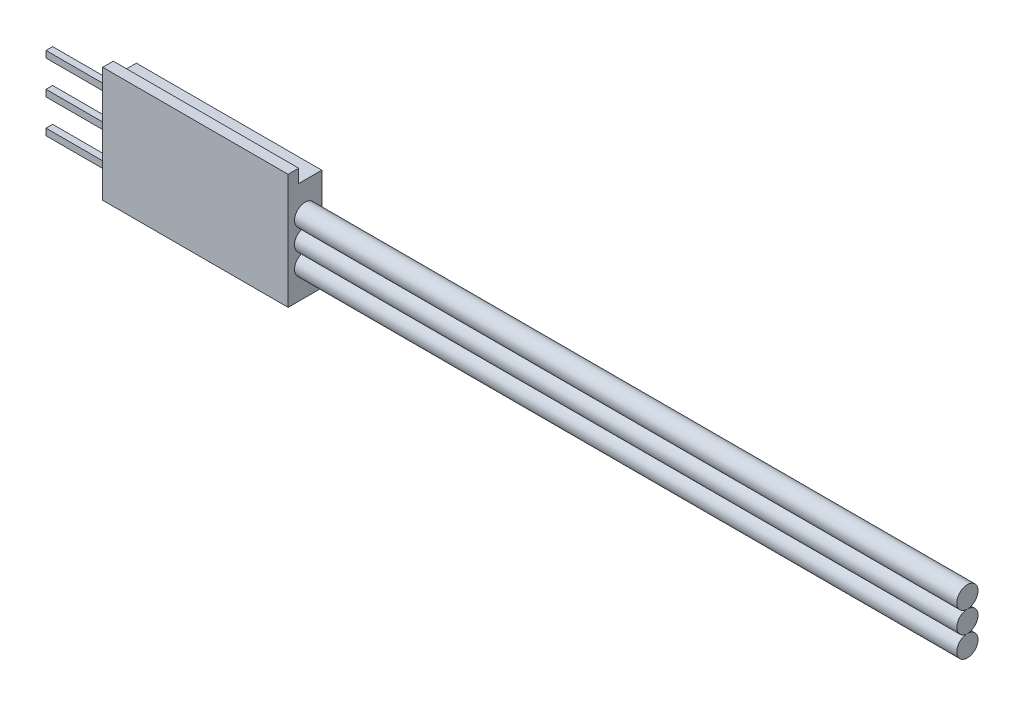
ISO-10303-21;
HEADER;
FILE_DESCRIPTION(('STEP AP214'),'2;1');
FILE_NAME('part.step','',(''),(''),'','','');
FILE_SCHEMA(('AUTOMOTIVE_DESIGN { 1 0 10303 214 1 1 1 1 }'));
ENDSEC;
DATA;
#1=APPLICATION_CONTEXT('core data for automotive mechanical design processes');
#2=APPLICATION_PROTOCOL_DEFINITION('international standard','automotive_design',2000,#1);
#3=PRODUCT_CONTEXT('',#1,'mechanical');
#4=PRODUCT('Part','Part','',(#3));
#5=PRODUCT_RELATED_PRODUCT_CATEGORY('part','',(#4));
#6=PRODUCT_DEFINITION_FORMATION('','',#4);
#7=PRODUCT_DEFINITION_CONTEXT('part definition',#1,'design');
#8=PRODUCT_DEFINITION('design','',#6,#7);
#9=PRODUCT_DEFINITION_SHAPE('','',#8);
#10=(LENGTH_UNIT() NAMED_UNIT(*) SI_UNIT(.MILLI.,.METRE.));
#11=(NAMED_UNIT(*) PLANE_ANGLE_UNIT() SI_UNIT($,.RADIAN.));
#12=(NAMED_UNIT(*) SI_UNIT($,.STERADIAN.) SOLID_ANGLE_UNIT());
#13=UNCERTAINTY_MEASURE_WITH_UNIT(LENGTH_MEASURE(1.E-05),#10,'distance_accuracy_value','');
#14=(GEOMETRIC_REPRESENTATION_CONTEXT(3) GLOBAL_UNCERTAINTY_ASSIGNED_CONTEXT((#13)) GLOBAL_UNIT_ASSIGNED_CONTEXT((#10,
#11,#12)) REPRESENTATION_CONTEXT('',''));
#15=CARTESIAN_POINT('',(0.,0.,0.));
#16=DIRECTION('',(0.,0.,1.));
#17=DIRECTION('',(1.,0.,0.));
#18=AXIS2_PLACEMENT_3D('',#15,#16,#17);
#19=CARTESIAN_POINT('',(7.01,0.,0.));
#20=DIRECTION('',(1.,0.,0.));
#21=DIRECTION('',(0.,0.,-1.));
#22=AXIS2_PLACEMENT_3D('',#19,#20,#21);
#23=PLANE('',#22);
#24=CARTESIAN_POINT('',(7.01,0.,0.));
#25=DIRECTION('',(1.,0.,0.));
#26=DIRECTION('',(0.,1.,0.));
#27=AXIS2_PLACEMENT_3D('',#24,#25,#26);
#28=CIRCLE('',#27,0.800000000000006);
#29=CARTESIAN_POINT('',(7.01,0.800000000000004,0.));
#30=VERTEX_POINT('',#29);
#31=EDGE_CURVE('P0_E17',#30,#30,#28,.T.);
#32=ORIENTED_EDGE('',*,*,#31,.F.);
#33=EDGE_LOOP('',(#32));
#34=FACE_BOUND('',#33,.T.);
#35=ADVANCED_FACE('P0_F14',(#34),#23,.F.);
#36=CARTESIAN_POINT('',(57.01,0.,0.));
#37=DIRECTION('',(1.,0.,0.));
#38=DIRECTION('',(0.,0.,-1.));
#39=AXIS2_PLACEMENT_3D('',#36,#37,#38);
#40=PLANE('',#39);
#41=CARTESIAN_POINT('',(57.01,0.,0.));
#42=DIRECTION('',(1.,0.,0.));
#43=DIRECTION('',(0.,1.,0.));
#44=AXIS2_PLACEMENT_3D('',#41,#42,#43);
#45=CIRCLE('',#44,0.800000000000006);
#46=CARTESIAN_POINT('',(57.01,0.799999999999919,0.));
#47=VERTEX_POINT('',#46);
#48=EDGE_CURVE('P0_E10',#47,#47,#45,.F.);
#49=ORIENTED_EDGE('',*,*,#48,.F.);
#50=EDGE_LOOP('',(#49));
#51=FACE_BOUND('',#50,.T.);
#52=ADVANCED_FACE('P0_F29',(#51),#40,.T.);
#53=CARTESIAN_POINT('',(6.01,0.,0.));
#54=DIRECTION('',(1.,0.,0.));
#55=DIRECTION('',(0.,1.,0.));
#56=AXIS2_PLACEMENT_3D('',#53,#54,#55);
#57=CYLINDRICAL_SURFACE('',#56,0.800000000000006);
#58=ORIENTED_EDGE('',*,*,#31,.T.);
#59=EDGE_LOOP('',(#58));
#60=FACE_BOUND('',#59,.T.);
#61=ORIENTED_EDGE('',*,*,#48,.T.);
#62=EDGE_LOOP('',(#61));
#63=FACE_BOUND('',#62,.T.);
#64=ADVANCED_FACE('P0_F26',(#60,#63),#57,.T.);
#65=CLOSED_SHELL('',(#35,#52,#64));
#66=MANIFOLD_SOLID_BREP('P0_B1',#65);
#67=CARTESIAN_POINT('',(-7.,-2.79,-0.25));
#68=DIRECTION('',(0.,-1.,0.));
#69=DIRECTION('',(0.,0.,-1.));
#70=AXIS2_PLACEMENT_3D('',#67,#68,#69);
#71=PLANE('',#70);
#72=DIRECTION('',(1.,0.,0.));
#73=VECTOR('',#72,1.);
#74=CARTESIAN_POINT('',(-7.,-2.79,0.25));
#75=LINE('',#74,#73);
#76=CARTESIAN_POINT('',(-12.3,-2.79,0.25));
#77=VERTEX_POINT('',#76);
#78=CARTESIAN_POINT('',(-7.,-2.79,0.25));
#79=VERTEX_POINT('',#78);
#80=EDGE_CURVE('P1_E142',#77,#79,#75,.T.);
#81=ORIENTED_EDGE('',*,*,#80,.F.);
#82=DIRECTION('',(0.,0.,-1.));
#83=VECTOR('',#82,1.);
#84=CARTESIAN_POINT('',(-12.3,-2.79,-0.25));
#85=LINE('',#84,#83);
#86=CARTESIAN_POINT('',(-12.3,-2.79,-0.25));
#87=VERTEX_POINT('',#86);
#88=EDGE_CURVE('P1_E147',#77,#87,#85,.T.);
#89=ORIENTED_EDGE('',*,*,#88,.T.);
#90=DIRECTION('',(-1.,0.,0.));
#91=VECTOR('',#90,1.);
#92=CARTESIAN_POINT('',(-7.,-2.79,-0.25));
#93=LINE('',#92,#91);
#94=CARTESIAN_POINT('',(-7.,-2.79,-0.25));
#95=VERTEX_POINT('',#94);
#96=EDGE_CURVE('P1_E145',#95,#87,#93,.T.);
#97=ORIENTED_EDGE('',*,*,#96,.F.);
#98=DIRECTION('',(0.,0.,-1.));
#99=VECTOR('',#98,1.);
#100=CARTESIAN_POINT('',(-7.,-2.79,-0.25));
#101=LINE('',#100,#99);
#102=EDGE_CURVE('P1_E19',#95,#79,#101,.F.);
#103=ORIENTED_EDGE('',*,*,#102,.T.);
#104=EDGE_LOOP('',(#81,#89,#97,#103));
#105=FACE_BOUND('',#104,.T.);
#106=ADVANCED_FACE('P1_F16',(#105),#71,.T.);
#107=CARTESIAN_POINT('',(-7.,0.25,-0.25));
#108=DIRECTION('',(0.,0.,-1.));
#109=DIRECTION('',(-1.,0.,0.));
#110=AXIS2_PLACEMENT_3D('',#107,#108,#109);
#111=PLANE('',#110);
#112=DIRECTION('',(1.,0.,0.));
#113=VECTOR('',#112,1.);
#114=CARTESIAN_POINT('',(-7.,-0.25,-0.25));
#115=LINE('',#114,#113);
#116=CARTESIAN_POINT('',(-12.3,-0.25,-0.25));
#117=VERTEX_POINT('',#116);
#118=CARTESIAN_POINT('',(-7.,-0.25,-0.25));
#119=VERTEX_POINT('',#118);
#120=EDGE_CURVE('P1_E183',#117,#119,#115,.T.);
#121=ORIENTED_EDGE('',*,*,#120,.F.);
#122=DIRECTION('',(0.,1.,0.));
#123=VECTOR('',#122,1.);
#124=CARTESIAN_POINT('',(-12.3,0.25,-0.25));
#125=LINE('',#124,#123);
#126=CARTESIAN_POINT('',(-12.3,0.25,-0.25));
#127=VERTEX_POINT('',#126);
#128=EDGE_CURVE('P1_E167',#117,#127,#125,.T.);
#129=ORIENTED_EDGE('',*,*,#128,.T.);
#130=DIRECTION('',(1.,0.,0.));
#131=VECTOR('',#130,1.);
#132=CARTESIAN_POINT('',(-7.,0.25,-0.25));
#133=LINE('',#132,#131);
#134=CARTESIAN_POINT('',(-7.,0.25,-0.25));
#135=VERTEX_POINT('',#134);
#136=EDGE_CURVE('P1_E193',#135,#127,#133,.F.);
#137=ORIENTED_EDGE('',*,*,#136,.F.);
#138=DIRECTION('',(0.,1.,0.));
#139=VECTOR('',#138,1.);
#140=CARTESIAN_POINT('',(-7.,0.25,-0.25));
#141=LINE('',#140,#139);
#142=EDGE_CURVE('P1_E169',#135,#119,#141,.F.);
#143=ORIENTED_EDGE('',*,*,#142,.T.);
#144=EDGE_LOOP('',(#121,#129,#137,#143));
#145=FACE_BOUND('',#144,.T.);
#146=ADVANCED_FACE('P1_F494',(#145),#111,.T.);
#147=CARTESIAN_POINT('',(-7.,2.79,-0.25));
#148=DIRECTION('',(0.,0.,-1.));
#149=DIRECTION('',(-1.,0.,0.));
#150=AXIS2_PLACEMENT_3D('',#147,#148,#149);
#151=PLANE('',#150);
#152=DIRECTION('',(1.,0.,0.));
#153=VECTOR('',#152,1.);
#154=CARTESIAN_POINT('',(-7.,2.29,-0.25));
#155=LINE('',#154,#153);
#156=CARTESIAN_POINT('',(-12.3,2.29,-0.25));
#157=VERTEX_POINT('',#156);
#158=CARTESIAN_POINT('',(-7.,2.29,-0.25));
#159=VERTEX_POINT('',#158);
#160=EDGE_CURVE('P1_E202',#157,#159,#155,.T.);
#161=ORIENTED_EDGE('',*,*,#160,.F.);
#162=DIRECTION('',(0.,1.,0.));
#163=VECTOR('',#162,1.);
#164=CARTESIAN_POINT('',(-12.3,2.79,-0.25));
#165=LINE('',#164,#163);
#166=CARTESIAN_POINT('',(-12.3,2.79,-0.25));
#167=VERTEX_POINT('',#166);
#168=EDGE_CURVE('P1_E160',#157,#167,#165,.T.);
#169=ORIENTED_EDGE('',*,*,#168,.T.);
#170=DIRECTION('',(1.,0.,0.));
#171=VECTOR('',#170,1.);
#172=CARTESIAN_POINT('',(-7.,2.79,-0.25));
#173=LINE('',#172,#171);
#174=CARTESIAN_POINT('',(-7.,2.79,-0.25));
#175=VERTEX_POINT('',#174);
#176=EDGE_CURVE('P1_E210',#175,#167,#173,.F.);
#177=ORIENTED_EDGE('',*,*,#176,.F.);
#178=DIRECTION('',(0.,1.,0.));
#179=VECTOR('',#178,1.);
#180=CARTESIAN_POINT('',(-7.,2.79,-0.25));
#181=LINE('',#180,#179);
#182=EDGE_CURVE('P1_E162',#175,#159,#181,.F.);
#183=ORIENTED_EDGE('',*,*,#182,.T.);
#184=EDGE_LOOP('',(#161,#169,#177,#183));
#185=FACE_BOUND('',#184,.T.);
#186=ADVANCED_FACE('P1_F486',(#185),#151,.T.);
#187=CARTESIAN_POINT('',(-7.,-2.79,0.25));
#188=DIRECTION('',(0.,0.,1.));
#189=DIRECTION('',(1.,0.,0.));
#190=AXIS2_PLACEMENT_3D('',#187,#188,#189);
#191=PLANE('',#190);
#192=DIRECTION('',(1.,0.,0.));
#193=VECTOR('',#192,1.);
#194=CARTESIAN_POINT('',(-7.,-2.29,0.25));
#195=LINE('',#194,#193);
#196=CARTESIAN_POINT('',(-12.3,-2.29,0.25));
#197=VERTEX_POINT('',#196);
#198=CARTESIAN_POINT('',(-7.,-2.29,0.25));
#199=VERTEX_POINT('',#198);
#200=EDGE_CURVE('P1_E223',#197,#199,#195,.T.);
#201=ORIENTED_EDGE('',*,*,#200,.F.);
#202=DIRECTION('',(0.,1.,0.));
#203=VECTOR('',#202,1.);
#204=CARTESIAN_POINT('',(-12.3,0.,0.25));
#205=LINE('',#204,#203);
#206=EDGE_CURVE('P1_E159',#77,#197,#205,.T.);
#207=ORIENTED_EDGE('',*,*,#206,.F.);
#208=ORIENTED_EDGE('',*,*,#80,.T.);
#209=DIRECTION('',(0.,1.,0.));
#210=VECTOR('',#209,1.);
#211=CARTESIAN_POINT('',(-7.,-2.79,0.25));
#212=LINE('',#211,#210);
#213=EDGE_CURVE('P1_E149',#79,#199,#212,.T.);
#214=ORIENTED_EDGE('',*,*,#213,.T.);
#215=EDGE_LOOP('',(#201,#207,#208,#214));
#216=FACE_BOUND('',#215,.T.);
#217=ADVANCED_FACE('P1_F157',(#216),#191,.T.);
#218=CARTESIAN_POINT('',(-7.,-2.29,-0.25));
#219=DIRECTION('',(0.,0.,-1.));
#220=DIRECTION('',(-1.,0.,0.));
#221=AXIS2_PLACEMENT_3D('',#218,#219,#220);
#222=PLANE('',#221);
#223=ORIENTED_EDGE('',*,*,#96,.T.);
#224=DIRECTION('',(0.,1.,0.));
#225=VECTOR('',#224,1.);
#226=CARTESIAN_POINT('',(-12.3,0.,-0.25));
#227=LINE('',#226,#225);
#228=CARTESIAN_POINT('',(-12.3,-2.29,-0.25));
#229=VERTEX_POINT('',#228);
#230=EDGE_CURVE('P1_E175',#229,#87,#227,.F.);
#231=ORIENTED_EDGE('',*,*,#230,.F.);
#232=DIRECTION('',(1.,0.,0.));
#233=VECTOR('',#232,1.);
#234=CARTESIAN_POINT('',(-7.,-2.29,-0.25));
#235=LINE('',#234,#233);
#236=CARTESIAN_POINT('',(-7.,-2.29,-0.25));
#237=VERTEX_POINT('',#236);
#238=EDGE_CURVE('P1_E225',#237,#229,#235,.F.);
#239=ORIENTED_EDGE('',*,*,#238,.F.);
#240=DIRECTION('',(0.,1.,0.));
#241=VECTOR('',#240,1.);
#242=CARTESIAN_POINT('',(-7.,-2.29,-0.25));
#243=LINE('',#242,#241);
#244=EDGE_CURVE('P1_E155',#237,#95,#243,.F.);
#245=ORIENTED_EDGE('',*,*,#244,.T.);
#246=EDGE_LOOP('',(#223,#231,#239,#245));
#247=FACE_BOUND('',#246,.T.);
#248=ADVANCED_FACE('P1_F173',(#247),#222,.T.);
#249=CARTESIAN_POINT('',(-12.3,0.,-1.27));
#250=DIRECTION('',(-1.,0.,0.));
#251=DIRECTION('',(0.,0.,1.));
#252=AXIS2_PLACEMENT_3D('',#249,#250,#251);
#253=PLANE('',#252);
#254=ORIENTED_EDGE('',*,*,#206,.T.);
#255=DIRECTION('',(0.,0.,1.));
#256=VECTOR('',#255,1.);
#257=CARTESIAN_POINT('',(-12.3,-2.29,0.25));
#258=LINE('',#257,#256);
#259=EDGE_CURVE('P1_E180',#229,#197,#258,.T.);
#260=ORIENTED_EDGE('',*,*,#259,.F.);
#261=ORIENTED_EDGE('',*,*,#230,.T.);
#262=ORIENTED_EDGE('',*,*,#88,.F.);
#263=EDGE_LOOP('',(#254,#260,#261,#262));
#264=FACE_BOUND('',#263,.T.);
#265=ADVANCED_FACE('P1_F178',(#264),#253,.T.);
#266=CARTESIAN_POINT('',(-7.,-0.25,-0.25));
#267=DIRECTION('',(0.,-1.,0.));
#268=DIRECTION('',(0.,0.,-1.));
#269=AXIS2_PLACEMENT_3D('',#266,#267,#268);
#270=PLANE('',#269);
#271=DIRECTION('',(1.,0.,0.));
#272=VECTOR('',#271,1.);
#273=CARTESIAN_POINT('',(-7.,-0.25,0.25));
#274=LINE('',#273,#272);
#275=CARTESIAN_POINT('',(-12.3,-0.25,0.25));
#276=VERTEX_POINT('',#275);
#277=CARTESIAN_POINT('',(-7.,-0.25,0.25));
#278=VERTEX_POINT('',#277);
#279=EDGE_CURVE('P1_E228',#276,#278,#274,.T.);
#280=ORIENTED_EDGE('',*,*,#279,.F.);
#281=DIRECTION('',(0.,0.,1.));
#282=VECTOR('',#281,1.);
#283=CARTESIAN_POINT('',(-12.3,-0.25,-1.27));
#284=LINE('',#283,#282);
#285=EDGE_CURVE('P1_E199',#117,#276,#284,.T.);
#286=ORIENTED_EDGE('',*,*,#285,.F.);
#287=ORIENTED_EDGE('',*,*,#120,.T.);
#288=DIRECTION('',(0.,0.,-1.));
#289=VECTOR('',#288,1.);
#290=CARTESIAN_POINT('',(-7.,-0.25,-0.25));
#291=LINE('',#290,#289);
#292=EDGE_CURVE('P1_E188',#119,#278,#291,.F.);
#293=ORIENTED_EDGE('',*,*,#292,.T.);
#294=EDGE_LOOP('',(#280,#286,#287,#293));
#295=FACE_BOUND('',#294,.T.);
#296=ADVANCED_FACE('P1_F455',(#295),#270,.T.);
#297=CARTESIAN_POINT('',(-7.,0.25,0.25));
#298=DIRECTION('',(0.,1.,0.));
#299=DIRECTION('',(0.,0.,1.));
#300=AXIS2_PLACEMENT_3D('',#297,#298,#299);
#301=PLANE('',#300);
#302=ORIENTED_EDGE('',*,*,#136,.T.);
#303=DIRECTION('',(0.,0.,1.));
#304=VECTOR('',#303,1.);
#305=CARTESIAN_POINT('',(-12.3,0.25,-1.27));
#306=LINE('',#305,#304);
#307=CARTESIAN_POINT('',(-12.3,0.25,0.25));
#308=VERTEX_POINT('',#307);
#309=EDGE_CURVE('P1_E196',#308,#127,#306,.F.);
#310=ORIENTED_EDGE('',*,*,#309,.F.);
#311=DIRECTION('',(1.,0.,0.));
#312=VECTOR('',#311,1.);
#313=CARTESIAN_POINT('',(-7.,0.25,0.25));
#314=LINE('',#313,#312);
#315=CARTESIAN_POINT('',(-7.,0.25,0.25));
#316=VERTEX_POINT('',#315);
#317=EDGE_CURVE('P1_E231',#316,#308,#314,.F.);
#318=ORIENTED_EDGE('',*,*,#317,.F.);
#319=DIRECTION('',(0.,0.,1.));
#320=VECTOR('',#319,1.);
#321=CARTESIAN_POINT('',(-7.,0.25,0.25));
#322=LINE('',#321,#320);
#323=EDGE_CURVE('P1_E190',#316,#135,#322,.F.);
#324=ORIENTED_EDGE('',*,*,#323,.T.);
#325=EDGE_LOOP('',(#302,#310,#318,#324));
#326=FACE_BOUND('',#325,.T.);
#327=ADVANCED_FACE('P1_F446',(#326),#301,.T.);
#328=CARTESIAN_POINT('',(-12.3,0.,-1.27));
#329=DIRECTION('',(-1.,0.,0.));
#330=DIRECTION('',(0.,0.,1.));
#331=AXIS2_PLACEMENT_3D('',#328,#329,#330);
#332=PLANE('',#331);
#333=ORIENTED_EDGE('',*,*,#285,.T.);
#334=DIRECTION('',(0.,1.,0.));
#335=VECTOR('',#334,1.);
#336=CARTESIAN_POINT('',(-12.3,-0.25,0.25));
#337=LINE('',#336,#335);
#338=EDGE_CURVE('P1_E234',#308,#276,#337,.F.);
#339=ORIENTED_EDGE('',*,*,#338,.F.);
#340=ORIENTED_EDGE('',*,*,#309,.T.);
#341=ORIENTED_EDGE('',*,*,#128,.F.);
#342=EDGE_LOOP('',(#333,#339,#340,#341));
#343=FACE_BOUND('',#342,.T.);
#344=ADVANCED_FACE('P1_F437',(#343),#332,.T.);
#345=CARTESIAN_POINT('',(-7.,2.29,-0.25));
#346=DIRECTION('',(0.,-1.,0.));
#347=DIRECTION('',(0.,0.,-1.));
#348=AXIS2_PLACEMENT_3D('',#345,#346,#347);
#349=PLANE('',#348);
#350=DIRECTION('',(1.,0.,0.));
#351=VECTOR('',#350,1.);
#352=CARTESIAN_POINT('',(-7.,2.29,0.25));
#353=LINE('',#352,#351);
#354=CARTESIAN_POINT('',(-12.3,2.29,0.25));
#355=VERTEX_POINT('',#354);
#356=CARTESIAN_POINT('',(-7.,2.29,0.25));
#357=VERTEX_POINT('',#356);
#358=EDGE_CURVE('P1_E237',#355,#357,#353,.T.);
#359=ORIENTED_EDGE('',*,*,#358,.F.);
#360=DIRECTION('',(0.,0.,1.));
#361=VECTOR('',#360,1.);
#362=CARTESIAN_POINT('',(-12.3,2.29,-1.27));
#363=LINE('',#362,#361);
#364=EDGE_CURVE('P1_E216',#157,#355,#363,.T.);
#365=ORIENTED_EDGE('',*,*,#364,.F.);
#366=ORIENTED_EDGE('',*,*,#160,.T.);
#367=DIRECTION('',(0.,0.,-1.));
#368=VECTOR('',#367,1.);
#369=CARTESIAN_POINT('',(-7.,2.29,-0.25));
#370=LINE('',#369,#368);
#371=EDGE_CURVE('P1_E205',#159,#357,#370,.F.);
#372=ORIENTED_EDGE('',*,*,#371,.T.);
#373=EDGE_LOOP('',(#359,#365,#366,#372));
#374=FACE_BOUND('',#373,.T.);
#375=ADVANCED_FACE('P1_F428',(#374),#349,.T.);
#376=CARTESIAN_POINT('',(-7.,2.79,0.25));
#377=DIRECTION('',(0.,1.,0.));
#378=DIRECTION('',(0.,0.,1.));
#379=AXIS2_PLACEMENT_3D('',#376,#377,#378);
#380=PLANE('',#379);
#381=ORIENTED_EDGE('',*,*,#176,.T.);
#382=DIRECTION('',(0.,0.,1.));
#383=VECTOR('',#382,1.);
#384=CARTESIAN_POINT('',(-12.3,2.79,-1.27));
#385=LINE('',#384,#383);
#386=CARTESIAN_POINT('',(-12.3,2.79,0.25));
#387=VERTEX_POINT('',#386);
#388=EDGE_CURVE('P1_E213',#387,#167,#385,.F.);
#389=ORIENTED_EDGE('',*,*,#388,.F.);
#390=DIRECTION('',(1.,0.,0.));
#391=VECTOR('',#390,1.);
#392=CARTESIAN_POINT('',(-7.,2.79,0.25));
#393=LINE('',#392,#391);
#394=CARTESIAN_POINT('',(-7.,2.79,0.25));
#395=VERTEX_POINT('',#394);
#396=EDGE_CURVE('P1_E240',#395,#387,#393,.F.);
#397=ORIENTED_EDGE('',*,*,#396,.F.);
#398=DIRECTION('',(0.,0.,1.));
#399=VECTOR('',#398,1.);
#400=CARTESIAN_POINT('',(-7.,2.79,0.25));
#401=LINE('',#400,#399);
#402=EDGE_CURVE('P1_E207',#395,#175,#401,.F.);
#403=ORIENTED_EDGE('',*,*,#402,.T.);
#404=EDGE_LOOP('',(#381,#389,#397,#403));
#405=FACE_BOUND('',#404,.T.);
#406=ADVANCED_FACE('P1_F419',(#405),#380,.T.);
#407=CARTESIAN_POINT('',(-12.3,0.,-1.27));
#408=DIRECTION('',(-1.,0.,0.));
#409=DIRECTION('',(0.,0.,1.));
#410=AXIS2_PLACEMENT_3D('',#407,#408,#409);
#411=PLANE('',#410);
#412=ORIENTED_EDGE('',*,*,#364,.T.);
#413=DIRECTION('',(0.,1.,0.));
#414=VECTOR('',#413,1.);
#415=CARTESIAN_POINT('',(-12.3,2.29,0.25));
#416=LINE('',#415,#414);
#417=EDGE_CURVE('P1_E243',#387,#355,#416,.F.);
#418=ORIENTED_EDGE('',*,*,#417,.F.);
#419=ORIENTED_EDGE('',*,*,#388,.T.);
#420=ORIENTED_EDGE('',*,*,#168,.F.);
#421=EDGE_LOOP('',(#412,#418,#419,#420));
#422=FACE_BOUND('',#421,.T.);
#423=ADVANCED_FACE('P1_F411',(#422),#411,.T.);
#424=CARTESIAN_POINT('',(-7.,3.85,0.47));
#425=DIRECTION('',(0.,0.,-1.));
#426=DIRECTION('',(-1.,0.,0.));
#427=AXIS2_PLACEMENT_3D('',#424,#425,#426);
#428=PLANE('',#427);
#429=DIRECTION('',(0.,1.,0.));
#430=VECTOR('',#429,1.);
#431=CARTESIAN_POINT('',(-7.,3.85,0.47));
#432=LINE('',#431,#430);
#433=CARTESIAN_POINT('',(-7.,3.85,0.47));
#434=VERTEX_POINT('',#433);
#435=CARTESIAN_POINT('',(-7.,4.85,0.47));
#436=VERTEX_POINT('',#435);
#437=EDGE_CURVE('P1_E221',#434,#436,#432,.T.);
#438=ORIENTED_EDGE('',*,*,#437,.T.);
#439=DIRECTION('',(1.,0.,0.));
#440=VECTOR('',#439,1.);
#441=CARTESIAN_POINT('',(-7.,4.85,0.47));
#442=LINE('',#441,#440);
#443=CARTESIAN_POINT('',(7.,4.85,0.47));
#444=VERTEX_POINT('',#443);
#445=EDGE_CURVE('P1_E251',#444,#436,#442,.F.);
#446=ORIENTED_EDGE('',*,*,#445,.F.);
#447=DIRECTION('',(0.,1.,0.));
#448=VECTOR('',#447,1.);
#449=CARTESIAN_POINT('',(7.,3.85,0.47));
#450=LINE('',#449,#448);
#451=CARTESIAN_POINT('',(7.,3.85,0.47));
#452=VERTEX_POINT('',#451);
#453=EDGE_CURVE('P1_E219',#444,#452,#450,.F.);
#454=ORIENTED_EDGE('',*,*,#453,.T.);
#455=DIRECTION('',(1.,0.,0.));
#456=VECTOR('',#455,1.);
#457=CARTESIAN_POINT('',(7.,3.85,0.47));
#458=LINE('',#457,#456);
#459=EDGE_CURVE('P1_E246',#434,#452,#458,.T.);
#460=ORIENTED_EDGE('',*,*,#459,.F.);
#461=EDGE_LOOP('',(#438,#446,#454,#460));
#462=FACE_BOUND('',#461,.T.);
#463=ADVANCED_FACE('P1_F312',(#462),#428,.T.);
#464=CARTESIAN_POINT('',(-7.,-2.29,0.25));
#465=DIRECTION('',(0.,1.,0.));
#466=DIRECTION('',(0.,0.,1.));
#467=AXIS2_PLACEMENT_3D('',#464,#465,#466);
#468=PLANE('',#467);
#469=ORIENTED_EDGE('',*,*,#238,.T.);
#470=ORIENTED_EDGE('',*,*,#259,.T.);
#471=ORIENTED_EDGE('',*,*,#200,.T.);
#472=DIRECTION('',(0.,0.,1.));
#473=VECTOR('',#472,1.);
#474=CARTESIAN_POINT('',(-7.,-2.29,-1.27));
#475=LINE('',#474,#473);
#476=EDGE_CURVE('P1_E152',#237,#199,#475,.T.);
#477=ORIENTED_EDGE('',*,*,#476,.F.);
#478=EDGE_LOOP('',(#469,#470,#471,#477));
#479=FACE_BOUND('',#478,.T.);
#480=ADVANCED_FACE('P1_F394',(#479),#468,.T.);
#481=CARTESIAN_POINT('',(-7.,-0.25,0.25));
#482=DIRECTION('',(0.,0.,1.));
#483=DIRECTION('',(1.,0.,0.));
#484=AXIS2_PLACEMENT_3D('',#481,#482,#483);
#485=PLANE('',#484);
#486=ORIENTED_EDGE('',*,*,#317,.T.);
#487=ORIENTED_EDGE('',*,*,#338,.T.);
#488=ORIENTED_EDGE('',*,*,#279,.T.);
#489=DIRECTION('',(0.,1.,0.));
#490=VECTOR('',#489,1.);
#491=CARTESIAN_POINT('',(-7.,3.85,0.25));
#492=LINE('',#491,#490);
#493=EDGE_CURVE('P1_E255',#316,#278,#492,.F.);
#494=ORIENTED_EDGE('',*,*,#493,.F.);
#495=EDGE_LOOP('',(#486,#487,#488,#494));
#496=FACE_BOUND('',#495,.T.);
#497=ADVANCED_FACE('P1_F385',(#496),#485,.T.);
#498=CARTESIAN_POINT('',(-7.,2.29,0.25));
#499=DIRECTION('',(0.,0.,1.));
#500=DIRECTION('',(1.,0.,0.));
#501=AXIS2_PLACEMENT_3D('',#498,#499,#500);
#502=PLANE('',#501);
#503=ORIENTED_EDGE('',*,*,#396,.T.);
#504=ORIENTED_EDGE('',*,*,#417,.T.);
#505=ORIENTED_EDGE('',*,*,#358,.T.);
#506=DIRECTION('',(0.,1.,0.));
#507=VECTOR('',#506,1.);
#508=CARTESIAN_POINT('',(-7.,3.85,0.25));
#509=LINE('',#508,#507);
#510=EDGE_CURVE('P1_E258',#395,#357,#509,.F.);
#511=ORIENTED_EDGE('',*,*,#510,.F.);
#512=EDGE_LOOP('',(#503,#504,#505,#511));
#513=FACE_BOUND('',#512,.T.);
#514=ADVANCED_FACE('P1_F323',(#513),#502,.T.);
#515=CARTESIAN_POINT('',(0.,0.,-1.27));
#516=DIRECTION('',(0.,0.,1.));
#517=DIRECTION('',(1.,0.,0.));
#518=AXIS2_PLACEMENT_3D('',#515,#516,#517);
#519=PLANE('',#518);
#520=DIRECTION('',(1.,0.,0.));
#521=VECTOR('',#520,1.);
#522=CARTESIAN_POINT('',(-7.,-3.85,-1.27));
#523=LINE('',#522,#521);
#524=CARTESIAN_POINT('',(-7.,-3.85,-1.27));
#525=VERTEX_POINT('',#524);
#526=CARTESIAN_POINT('',(7.,-3.85,-1.27));
#527=VERTEX_POINT('',#526);
#528=EDGE_CURVE('P1_E272',#525,#527,#523,.T.);
#529=ORIENTED_EDGE('',*,*,#528,.F.);
#530=DIRECTION('',(0.,1.,0.));
#531=VECTOR('',#530,1.);
#532=CARTESIAN_POINT('',(-7.,3.85,-1.27));
#533=LINE('',#532,#531);
#534=CARTESIAN_POINT('',(-7.,3.85,-1.27));
#535=VERTEX_POINT('',#534);
#536=EDGE_CURVE('P1_E264',#535,#525,#533,.F.);
#537=ORIENTED_EDGE('',*,*,#536,.F.);
#538=DIRECTION('',(1.,0.,0.));
#539=VECTOR('',#538,1.);
#540=CARTESIAN_POINT('',(7.,3.85,-1.27));
#541=LINE('',#540,#539);
#542=CARTESIAN_POINT('',(7.,3.85,-1.27));
#543=VERTEX_POINT('',#542);
#544=EDGE_CURVE('P1_E249',#543,#535,#541,.F.);
#545=ORIENTED_EDGE('',*,*,#544,.F.);
#546=DIRECTION('',(0.,1.,0.));
#547=VECTOR('',#546,1.);
#548=CARTESIAN_POINT('',(7.,-3.85,-1.27));
#549=LINE('',#548,#547);
#550=EDGE_CURVE('P1_E278',#527,#543,#549,.T.);
#551=ORIENTED_EDGE('',*,*,#550,.F.);
#552=EDGE_LOOP('',(#529,#537,#545,#551));
#553=FACE_BOUND('',#552,.T.);
#554=ADVANCED_FACE('P1_F302',(#553),#519,.F.);
#555=CARTESIAN_POINT('',(7.,3.85,-1.27));
#556=DIRECTION('',(0.,1.,0.));
#557=DIRECTION('',(0.,0.,1.));
#558=AXIS2_PLACEMENT_3D('',#555,#556,#557);
#559=PLANE('',#558);
#560=DIRECTION('',(0.,0.,-1.));
#561=VECTOR('',#560,1.);
#562=CARTESIAN_POINT('',(7.,3.85,-1.27));
#563=LINE('',#562,#561);
#564=EDGE_CURVE('P1_E281',#543,#452,#563,.F.);
#565=ORIENTED_EDGE('',*,*,#564,.F.);
#566=ORIENTED_EDGE('',*,*,#544,.T.);
#567=DIRECTION('',(0.,0.,1.));
#568=VECTOR('',#567,1.);
#569=CARTESIAN_POINT('',(-7.,3.85,-1.27));
#570=LINE('',#569,#568);
#571=EDGE_CURVE('P1_E261',#434,#535,#570,.F.);
#572=ORIENTED_EDGE('',*,*,#571,.F.);
#573=ORIENTED_EDGE('',*,*,#459,.T.);
#574=EDGE_LOOP('',(#565,#566,#572,#573));
#575=FACE_BOUND('',#574,.T.);
#576=ADVANCED_FACE('P1_F314',(#575),#559,.T.);
#577=CARTESIAN_POINT('',(-7.,4.85,0.47));
#578=DIRECTION('',(0.,1.,0.));
#579=DIRECTION('',(0.,0.,1.));
#580=AXIS2_PLACEMENT_3D('',#577,#578,#579);
#581=PLANE('',#580);
#582=DIRECTION('',(1.,0.,0.));
#583=VECTOR('',#582,1.);
#584=CARTESIAN_POINT('',(0.,4.85,1.27));
#585=LINE('',#584,#583);
#586=CARTESIAN_POINT('',(7.,4.85,1.27));
#587=VERTEX_POINT('',#586);
#588=CARTESIAN_POINT('',(-7.,4.85,1.27));
#589=VERTEX_POINT('',#588);
#590=EDGE_CURVE('P1_E284',#587,#589,#585,.F.);
#591=ORIENTED_EDGE('',*,*,#590,.F.);
#592=DIRECTION('',(0.,0.,-1.));
#593=VECTOR('',#592,1.);
#594=CARTESIAN_POINT('',(7.,4.85,-1.27));
#595=LINE('',#594,#593);
#596=EDGE_CURVE('P1_E274',#444,#587,#595,.F.);
#597=ORIENTED_EDGE('',*,*,#596,.F.);
#598=ORIENTED_EDGE('',*,*,#445,.T.);
#599=DIRECTION('',(0.,0.,1.));
#600=VECTOR('',#599,1.);
#601=CARTESIAN_POINT('',(-7.,4.85,-1.27));
#602=LINE('',#601,#600);
#603=EDGE_CURVE('P1_E266',#589,#436,#602,.F.);
#604=ORIENTED_EDGE('',*,*,#603,.F.);
#605=EDGE_LOOP('',(#591,#597,#598,#604));
#606=FACE_BOUND('',#605,.T.);
#607=ADVANCED_FACE('P1_F309',(#606),#581,.T.);
#608=CARTESIAN_POINT('',(-7.,3.85,-1.27));
#609=DIRECTION('',(-1.,0.,0.));
#610=DIRECTION('',(0.,0.,1.));
#611=AXIS2_PLACEMENT_3D('',#608,#609,#610);
#612=PLANE('',#611);
#613=DIRECTION('',(0.,1.,0.));
#614=VECTOR('',#613,1.);
#615=CARTESIAN_POINT('',(-7.,0.,1.27));
#616=LINE('',#615,#614);
#617=CARTESIAN_POINT('',(-7.,-3.85,1.27));
#618=VERTEX_POINT('',#617);
#619=EDGE_CURVE('P1_E287',#589,#618,#616,.F.);
#620=ORIENTED_EDGE('',*,*,#619,.F.);
#621=ORIENTED_EDGE('',*,*,#603,.T.);
#622=ORIENTED_EDGE('',*,*,#437,.F.);
#623=ORIENTED_EDGE('',*,*,#571,.T.);
#624=ORIENTED_EDGE('',*,*,#536,.T.);
#625=DIRECTION('',(0.,0.,-1.));
#626=VECTOR('',#625,1.);
#627=CARTESIAN_POINT('',(-7.,-3.85,-1.27));
#628=LINE('',#627,#626);
#629=EDGE_CURVE('P1_E269',#618,#525,#628,.T.);
#630=ORIENTED_EDGE('',*,*,#629,.F.);
#631=EDGE_LOOP('',(#620,#621,#622,#623,#624,#630));
#632=FACE_BOUND('',#631,.T.);
#633=ORIENTED_EDGE('',*,*,#402,.F.);
#634=ORIENTED_EDGE('',*,*,#510,.T.);
#635=ORIENTED_EDGE('',*,*,#371,.F.);
#636=ORIENTED_EDGE('',*,*,#182,.F.);
#637=EDGE_LOOP('',(#633,#634,#635,#636));
#638=FACE_BOUND('',#637,.T.);
#639=ORIENTED_EDGE('',*,*,#323,.F.);
#640=ORIENTED_EDGE('',*,*,#493,.T.);
#641=ORIENTED_EDGE('',*,*,#292,.F.);
#642=ORIENTED_EDGE('',*,*,#142,.F.);
#643=EDGE_LOOP('',(#639,#640,#641,#642));
#644=FACE_BOUND('',#643,.T.);
#645=ORIENTED_EDGE('',*,*,#244,.F.);
#646=ORIENTED_EDGE('',*,*,#476,.T.);
#647=ORIENTED_EDGE('',*,*,#213,.F.);
#648=ORIENTED_EDGE('',*,*,#102,.F.);
#649=EDGE_LOOP('',(#645,#646,#647,#648));
#650=FACE_BOUND('',#649,.T.);
#651=ADVANCED_FACE('P1_F150',(#632,#638,#644,#650),#612,.T.);
#652=CARTESIAN_POINT('',(-7.,-3.85,-1.27));
#653=DIRECTION('',(0.,-1.,0.));
#654=DIRECTION('',(0.,0.,-1.));
#655=AXIS2_PLACEMENT_3D('',#652,#653,#654);
#656=PLANE('',#655);
#657=DIRECTION('',(0.,0.,-1.));
#658=VECTOR('',#657,1.);
#659=CARTESIAN_POINT('',(7.,-3.85,-1.27));
#660=LINE('',#659,#658);
#661=CARTESIAN_POINT('',(7.,-3.85,1.27));
#662=VERTEX_POINT('',#661);
#663=EDGE_CURVE('P1_E34',#662,#527,#660,.T.);
#664=ORIENTED_EDGE('',*,*,#663,.F.);
#665=DIRECTION('',(1.,0.,0.));
#666=VECTOR('',#665,1.);
#667=CARTESIAN_POINT('',(0.,-3.85,1.27));
#668=LINE('',#667,#666);
#669=EDGE_CURVE('P1_E25',#618,#662,#668,.T.);
#670=ORIENTED_EDGE('',*,*,#669,.F.);
#671=ORIENTED_EDGE('',*,*,#629,.T.);
#672=ORIENTED_EDGE('',*,*,#528,.T.);
#673=EDGE_LOOP('',(#664,#670,#671,#672));
#674=FACE_BOUND('',#673,.T.);
#675=ADVANCED_FACE('P1_F294',(#674),#656,.T.);
#676=CARTESIAN_POINT('',(7.,-3.85,-1.27));
#677=DIRECTION('',(1.,0.,0.));
#678=DIRECTION('',(0.,0.,-1.));
#679=AXIS2_PLACEMENT_3D('',#676,#677,#678);
#680=PLANE('',#679);
#681=ORIENTED_EDGE('',*,*,#564,.T.);
#682=ORIENTED_EDGE('',*,*,#453,.F.);
#683=ORIENTED_EDGE('',*,*,#596,.T.);
#684=DIRECTION('',(0.,1.,0.));
#685=VECTOR('',#684,1.);
#686=CARTESIAN_POINT('',(7.,0.,1.27));
#687=LINE('',#686,#685);
#688=EDGE_CURVE('P1_E11',#662,#587,#687,.T.);
#689=ORIENTED_EDGE('',*,*,#688,.F.);
#690=ORIENTED_EDGE('',*,*,#663,.T.);
#691=ORIENTED_EDGE('',*,*,#550,.T.);
#692=EDGE_LOOP('',(#681,#682,#683,#689,#690,#691));
#693=FACE_BOUND('',#692,.T.);
#694=ADVANCED_FACE('P1_F305',(#693),#680,.T.);
#695=CARTESIAN_POINT('',(0.,0.,1.27));
#696=DIRECTION('',(0.,0.,1.));
#697=DIRECTION('',(1.,0.,0.));
#698=AXIS2_PLACEMENT_3D('',#695,#696,#697);
#699=PLANE('',#698);
#700=ORIENTED_EDGE('',*,*,#669,.T.);
#701=ORIENTED_EDGE('',*,*,#688,.T.);
#702=ORIENTED_EDGE('',*,*,#590,.T.);
#703=ORIENTED_EDGE('',*,*,#619,.T.);
#704=EDGE_LOOP('',(#700,#701,#702,#703));
#705=FACE_BOUND('',#704,.T.);
#706=ADVANCED_FACE('P1_F292',(#705),#699,.T.);
#707=CLOSED_SHELL('',(#106,#146,#186,#217,#248,#265,#296,#327,#344,#375,#406,#423,#463,#480,
#497,#514,#554,#576,#607,#651,#675,#694,#706));
#708=MANIFOLD_SOLID_BREP('P1_B1',#707);
#709=CARTESIAN_POINT('',(7.01,-1.6,0.));
#710=DIRECTION('',(1.,0.,0.));
#711=DIRECTION('',(0.,1.,0.));
#712=AXIS2_PLACEMENT_3D('',#709,#710,#711);
#713=PLANE('',#712);
#714=CARTESIAN_POINT('',(7.00999999999999,-1.6,-9.31962616193417E-13));
#715=DIRECTION('',(1.,0.,0.));
#716=DIRECTION('',(0.,1.,0.));
#717=AXIS2_PLACEMENT_3D('',#714,#715,#716);
#718=CIRCLE('',#717,0.799999999999449);
#719=CARTESIAN_POINT('',(7.00999999999999,-0.800000000000549,-9.31962616193417E-13));
#720=VERTEX_POINT('',#719);
#721=EDGE_CURVE('P2_E19',#720,#720,#718,.T.);
#722=ORIENTED_EDGE('',*,*,#721,.F.);
#723=EDGE_LOOP('',(#722));
#724=FACE_BOUND('',#723,.T.);
#725=ADVANCED_FACE('P2_F16',(#724),#713,.F.);
#726=CARTESIAN_POINT('',(57.01,-1.6,0.));
#727=DIRECTION('',(1.,0.,0.));
#728=DIRECTION('',(0.,1.,0.));
#729=AXIS2_PLACEMENT_3D('',#726,#727,#728);
#730=PLANE('',#729);
#731=CARTESIAN_POINT('',(57.01,-1.59999999999991,-8.55189900363326E-13));
#732=DIRECTION('',(1.,0.,0.));
#733=DIRECTION('',(0.,1.,0.));
#734=AXIS2_PLACEMENT_3D('',#731,#732,#733);
#735=CIRCLE('',#734,0.799999999999449);
#736=CARTESIAN_POINT('',(57.01,-0.800000000000464,-8.55189900363326E-13));
#737=VERTEX_POINT('',#736);
#738=EDGE_CURVE('P2_E10',#737,#737,#735,.F.);
#739=ORIENTED_EDGE('',*,*,#738,.F.);
#740=EDGE_LOOP('',(#739));
#741=FACE_BOUND('',#740,.T.);
#742=ADVANCED_FACE('P2_F31',(#741),#730,.T.);
#743=CARTESIAN_POINT('',(6.01,-1.6,-9.33498070510019E-13));
#744=DIRECTION('',(1.,0.,0.));
#745=DIRECTION('',(0.,1.,0.));
#746=AXIS2_PLACEMENT_3D('',#743,#744,#745);
#747=CYLINDRICAL_SURFACE('',#746,0.799999999999449);
#748=ORIENTED_EDGE('',*,*,#721,.T.);
#749=EDGE_LOOP('',(#748));
#750=FACE_BOUND('',#749,.T.);
#751=ORIENTED_EDGE('',*,*,#738,.T.);
#752=EDGE_LOOP('',(#751));
#753=FACE_BOUND('',#752,.T.);
#754=ADVANCED_FACE('P2_F28',(#750,#753),#747,.T.);
#755=CLOSED_SHELL('',(#725,#742,#754));
#756=MANIFOLD_SOLID_BREP('P2_B1',#755);
#757=CARTESIAN_POINT('',(7.01,1.6,0.));
#758=DIRECTION('',(1.,0.,0.));
#759=DIRECTION('',(0.,1.,0.));
#760=AXIS2_PLACEMENT_3D('',#757,#758,#759);
#761=PLANE('',#760);
#762=CARTESIAN_POINT('',(7.00999999999999,1.6,9.31962616193417E-13));
#763=DIRECTION('',(1.,0.,0.));
#764=DIRECTION('',(0.,1.,0.));
#765=AXIS2_PLACEMENT_3D('',#762,#763,#764);
#766=CIRCLE('',#765,0.799999999999449);
#767=CARTESIAN_POINT('',(7.00999999999999,2.39999999999945,9.31962616193417E-13));
#768=VERTEX_POINT('',#767);
#769=EDGE_CURVE('P3_E17',#768,#768,#766,.T.);
#770=ORIENTED_EDGE('',*,*,#769,.F.);
#771=EDGE_LOOP('',(#770));
#772=FACE_BOUND('',#771,.T.);
#773=ADVANCED_FACE('P3_F14',(#772),#761,.F.);
#774=CARTESIAN_POINT('',(57.01,1.6,0.));
#775=DIRECTION('',(1.,0.,0.));
#776=DIRECTION('',(0.,1.,0.));
#777=AXIS2_PLACEMENT_3D('',#774,#775,#776);
#778=PLANE('',#777);
#779=CARTESIAN_POINT('',(57.01,1.59999999999991,8.55189900363326E-13));
#780=DIRECTION('',(1.,0.,0.));
#781=DIRECTION('',(0.,1.,0.));
#782=AXIS2_PLACEMENT_3D('',#779,#780,#781);
#783=CIRCLE('',#782,0.799999999999449);
#784=CARTESIAN_POINT('',(57.01,2.39999999999936,8.55189900363326E-13));
#785=VERTEX_POINT('',#784);
#786=EDGE_CURVE('P3_E10',#785,#785,#783,.F.);
#787=ORIENTED_EDGE('',*,*,#786,.F.);
#788=EDGE_LOOP('',(#787));
#789=FACE_BOUND('',#788,.T.);
#790=ADVANCED_FACE('P3_F29',(#789),#778,.T.);
#791=CARTESIAN_POINT('',(6.01,1.6,9.33498070510019E-13));
#792=DIRECTION('',(1.,0.,0.));
#793=DIRECTION('',(0.,1.,0.));
#794=AXIS2_PLACEMENT_3D('',#791,#792,#793);
#795=CYLINDRICAL_SURFACE('',#794,0.799999999999449);
#796=ORIENTED_EDGE('',*,*,#769,.T.);
#797=EDGE_LOOP('',(#796));
#798=FACE_BOUND('',#797,.T.);
#799=ORIENTED_EDGE('',*,*,#786,.T.);
#800=EDGE_LOOP('',(#799));
#801=FACE_BOUND('',#800,.T.);
#802=ADVANCED_FACE('P3_F26',(#798,#801),#795,.T.);
#803=CLOSED_SHELL('',(#773,#790,#802));
#804=MANIFOLD_SOLID_BREP('P3_B1',#803);
#805=ADVANCED_BREP_SHAPE_REPRESENTATION('',(#18,#66,#708,#756,#804),#14);
#806=SHAPE_DEFINITION_REPRESENTATION(#9,#805);
ENDSEC;
END-ISO-10303-21;
